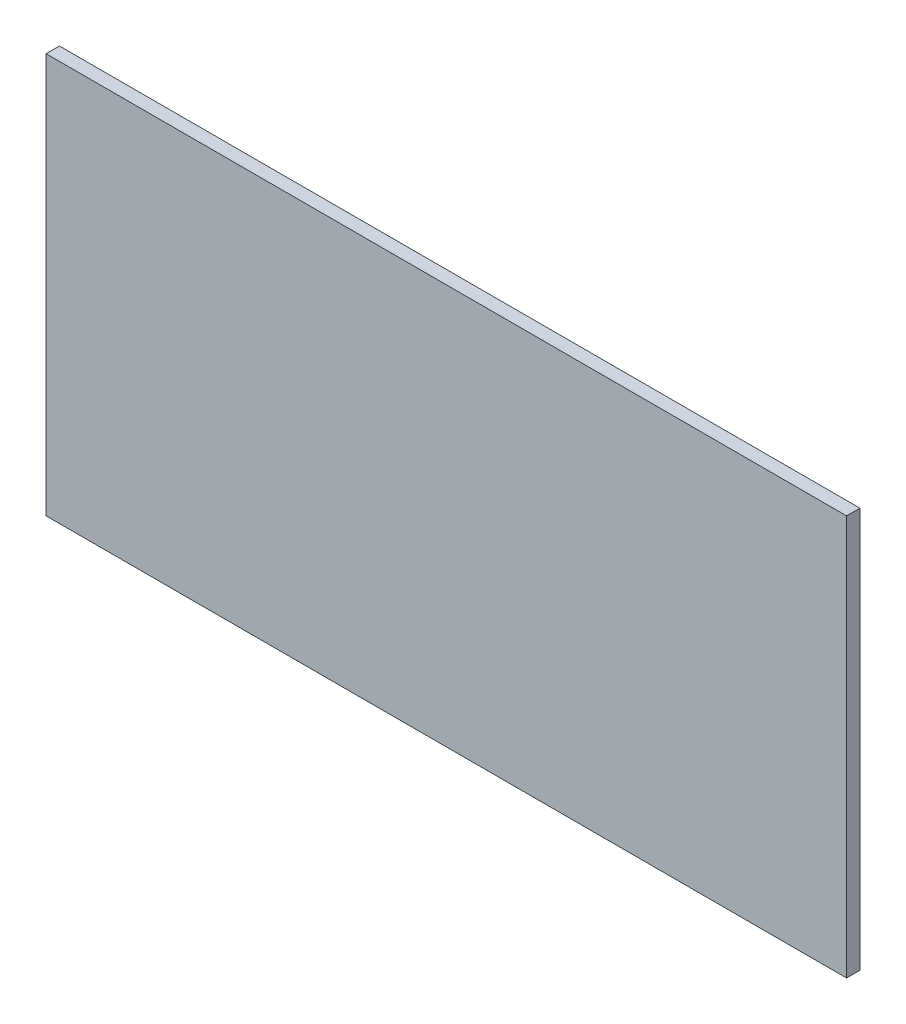
ISO-10303-21;
HEADER;
FILE_DESCRIPTION(('STEP AP214'),'2;1');
FILE_NAME('part.step','',(''),(''),'','','');
FILE_SCHEMA(('AUTOMOTIVE_DESIGN { 1 0 10303 214 1 1 1 1 }'));
ENDSEC;
DATA;
#1=APPLICATION_CONTEXT('core data for automotive mechanical design processes');
#2=APPLICATION_PROTOCOL_DEFINITION('international standard','automotive_design',2000,#1);
#3=PRODUCT_CONTEXT('',#1,'mechanical');
#4=PRODUCT('Part','Part','',(#3));
#5=PRODUCT_RELATED_PRODUCT_CATEGORY('part','',(#4));
#6=PRODUCT_DEFINITION_FORMATION('','',#4);
#7=PRODUCT_DEFINITION_CONTEXT('part definition',#1,'design');
#8=PRODUCT_DEFINITION('design','',#6,#7);
#9=PRODUCT_DEFINITION_SHAPE('','',#8);
#10=(LENGTH_UNIT() NAMED_UNIT(*) SI_UNIT(.MILLI.,.METRE.));
#11=(NAMED_UNIT(*) PLANE_ANGLE_UNIT() SI_UNIT($,.RADIAN.));
#12=(NAMED_UNIT(*) SI_UNIT($,.STERADIAN.) SOLID_ANGLE_UNIT());
#13=UNCERTAINTY_MEASURE_WITH_UNIT(LENGTH_MEASURE(1.E-05),#10,'distance_accuracy_value','');
#14=(GEOMETRIC_REPRESENTATION_CONTEXT(3) GLOBAL_UNCERTAINTY_ASSIGNED_CONTEXT((#13)) GLOBAL_UNIT_ASSIGNED_CONTEXT((#10,
#11,#12)) REPRESENTATION_CONTEXT('',''));
#15=CARTESIAN_POINT('',(0.,0.,0.));
#16=DIRECTION('',(0.,0.,1.));
#17=DIRECTION('',(1.,0.,0.));
#18=AXIS2_PLACEMENT_3D('',#15,#16,#17);
#19=CARTESIAN_POINT('',(60.,0.,-92.));
#20=DIRECTION('',(0.,1.,0.));
#21=DIRECTION('',(0.,0.,1.));
#22=AXIS2_PLACEMENT_3D('',#19,#20,#21);
#23=PLANE('',#22);
#24=DIRECTION('',(-1.,0.,0.));
#25=VECTOR('',#24,1.);
#26=CARTESIAN_POINT('',(60.,0.,-90.));
#27=LINE('',#26,#25);
#28=CARTESIAN_POINT('',(60.,0.,-90.));
#29=VERTEX_POINT('',#28);
#30=CARTESIAN_POINT('',(-60.,0.,-90.));
#31=VERTEX_POINT('',#30);
#32=EDGE_CURVE('E148',#29,#31,#27,.T.);
#33=ORIENTED_EDGE('',*,*,#32,.T.);
#34=DIRECTION('',(0.,0.,1.));
#35=VECTOR('',#34,1.);
#36=CARTESIAN_POINT('',(-60.,0.,-92.));
#37=LINE('',#36,#35);
#38=CARTESIAN_POINT('',(-60.,0.,-92.));
#39=VERTEX_POINT('',#38);
#40=EDGE_CURVE('E12',#39,#31,#37,.T.);
#41=ORIENTED_EDGE('',*,*,#40,.F.);
#42=DIRECTION('',(-1.,0.,0.));
#43=VECTOR('',#42,1.);
#44=CARTESIAN_POINT('',(60.,0.,-92.));
#45=LINE('',#44,#43);
#46=CARTESIAN_POINT('',(60.,0.,-92.));
#47=VERTEX_POINT('',#46);
#48=EDGE_CURVE('E103',#47,#39,#45,.T.);
#49=ORIENTED_EDGE('',*,*,#48,.F.);
#50=DIRECTION('',(0.,0.,1.));
#51=VECTOR('',#50,1.);
#52=CARTESIAN_POINT('',(60.,0.,-92.));
#53=LINE('',#52,#51);
#54=EDGE_CURVE('E65',#47,#29,#53,.T.);
#55=ORIENTED_EDGE('',*,*,#54,.T.);
#56=EDGE_LOOP('',(#33,#41,#49,#55));
#57=FACE_BOUND('',#56,.T.);
#58=ADVANCED_FACE('F43',(#57),#23,.F.);
#59=CARTESIAN_POINT('',(-60.,0.,-92.));
#60=DIRECTION('',(1.,0.,0.));
#61=DIRECTION('',(0.,0.,-1.));
#62=AXIS2_PLACEMENT_3D('',#59,#60,#61);
#63=PLANE('',#62);
#64=DIRECTION('',(0.,1.,0.));
#65=VECTOR('',#64,1.);
#66=CARTESIAN_POINT('',(-60.,0.,-90.));
#67=LINE('',#66,#65);
#68=CARTESIAN_POINT('',(-60.,60.,-90.));
#69=VERTEX_POINT('',#68);
#70=EDGE_CURVE('E109',#31,#69,#67,.T.);
#71=ORIENTED_EDGE('',*,*,#70,.T.);
#72=DIRECTION('',(0.,0.,1.));
#73=VECTOR('',#72,1.);
#74=CARTESIAN_POINT('',(-60.,60.,-92.));
#75=LINE('',#74,#73);
#76=CARTESIAN_POINT('',(-60.,60.,-92.));
#77=VERTEX_POINT('',#76);
#78=EDGE_CURVE('E54',#77,#69,#75,.T.);
#79=ORIENTED_EDGE('',*,*,#78,.F.);
#80=DIRECTION('',(0.,1.,0.));
#81=VECTOR('',#80,1.);
#82=CARTESIAN_POINT('',(-60.,0.,-92.));
#83=LINE('',#82,#81);
#84=EDGE_CURVE('E95',#39,#77,#83,.T.);
#85=ORIENTED_EDGE('',*,*,#84,.F.);
#86=ORIENTED_EDGE('',*,*,#40,.T.);
#87=EDGE_LOOP('',(#71,#79,#85,#86));
#88=FACE_BOUND('',#87,.T.);
#89=ADVANCED_FACE('F108',(#88),#63,.F.);
#90=CARTESIAN_POINT('',(60.,60.,-92.));
#91=DIRECTION('',(0.,1.,0.));
#92=DIRECTION('',(0.,0.,1.));
#93=AXIS2_PLACEMENT_3D('',#90,#91,#92);
#94=PLANE('',#93);
#95=DIRECTION('',(-1.,0.,0.));
#96=VECTOR('',#95,1.);
#97=CARTESIAN_POINT('',(60.,60.,-90.));
#98=LINE('',#97,#96);
#99=CARTESIAN_POINT('',(60.,60.,-90.));
#100=VERTEX_POINT('',#99);
#101=EDGE_CURVE('E134',#100,#69,#98,.T.);
#102=ORIENTED_EDGE('',*,*,#101,.F.);
#103=DIRECTION('',(0.,0.,1.));
#104=VECTOR('',#103,1.);
#105=CARTESIAN_POINT('',(60.,60.,-92.));
#106=LINE('',#105,#104);
#107=CARTESIAN_POINT('',(60.,60.,-92.));
#108=VERTEX_POINT('',#107);
#109=EDGE_CURVE('E83',#108,#100,#106,.T.);
#110=ORIENTED_EDGE('',*,*,#109,.F.);
#111=DIRECTION('',(-1.,0.,0.));
#112=VECTOR('',#111,1.);
#113=CARTESIAN_POINT('',(60.,60.,-92.));
#114=LINE('',#113,#112);
#115=EDGE_CURVE('E102',#108,#77,#114,.T.);
#116=ORIENTED_EDGE('',*,*,#115,.T.);
#117=ORIENTED_EDGE('',*,*,#78,.T.);
#118=EDGE_LOOP('',(#102,#110,#116,#117));
#119=FACE_BOUND('',#118,.T.);
#120=ADVANCED_FACE('F113',(#119),#94,.T.);
#121=CARTESIAN_POINT('',(60.,0.,-92.));
#122=DIRECTION('',(1.,0.,0.));
#123=DIRECTION('',(0.,0.,-1.));
#124=AXIS2_PLACEMENT_3D('',#121,#122,#123);
#125=PLANE('',#124);
#126=DIRECTION('',(0.,1.,0.));
#127=VECTOR('',#126,1.);
#128=CARTESIAN_POINT('',(60.,0.,-90.));
#129=LINE('',#128,#127);
#130=EDGE_CURVE('E128',#29,#100,#129,.T.);
#131=ORIENTED_EDGE('',*,*,#130,.F.);
#132=ORIENTED_EDGE('',*,*,#54,.F.);
#133=DIRECTION('',(0.,1.,0.));
#134=VECTOR('',#133,1.);
#135=CARTESIAN_POINT('',(60.,0.,-92.));
#136=LINE('',#135,#134);
#137=EDGE_CURVE('E115',#47,#108,#136,.T.);
#138=ORIENTED_EDGE('',*,*,#137,.T.);
#139=ORIENTED_EDGE('',*,*,#109,.T.);
#140=EDGE_LOOP('',(#131,#132,#138,#139));
#141=FACE_BOUND('',#140,.T.);
#142=ADVANCED_FACE('F154',(#141),#125,.T.);
#143=CARTESIAN_POINT('',(0.,0.,-92.));
#144=DIRECTION('',(0.,0.,-1.));
#145=DIRECTION('',(-1.,0.,0.));
#146=AXIS2_PLACEMENT_3D('',#143,#144,#145);
#147=PLANE('',#146);
#148=ORIENTED_EDGE('',*,*,#48,.T.);
#149=ORIENTED_EDGE('',*,*,#84,.T.);
#150=ORIENTED_EDGE('',*,*,#115,.F.);
#151=ORIENTED_EDGE('',*,*,#137,.F.);
#152=EDGE_LOOP('',(#148,#149,#150,#151));
#153=FACE_BOUND('',#152,.T.);
#154=ADVANCED_FACE('F99',(#153),#147,.T.);
#155=CARTESIAN_POINT('',(0.,0.,-90.));
#156=DIRECTION('',(0.,0.,-1.));
#157=DIRECTION('',(-1.,0.,0.));
#158=AXIS2_PLACEMENT_3D('',#155,#156,#157);
#159=PLANE('',#158);
#160=ORIENTED_EDGE('',*,*,#32,.F.);
#161=ORIENTED_EDGE('',*,*,#130,.T.);
#162=ORIENTED_EDGE('',*,*,#101,.T.);
#163=ORIENTED_EDGE('',*,*,#70,.F.);
#164=EDGE_LOOP('',(#160,#161,#162,#163));
#165=FACE_BOUND('',#164,.T.);
#166=ADVANCED_FACE('F153',(#165),#159,.F.);
#167=CLOSED_SHELL('',(#58,#89,#120,#142,#154,#166));
#168=MANIFOLD_SOLID_BREP('B2',#167);
#169=ADVANCED_BREP_SHAPE_REPRESENTATION('',(#18,#168),#14);
#170=SHAPE_DEFINITION_REPRESENTATION(#9,#169);
ENDSEC;
END-ISO-10303-21;
